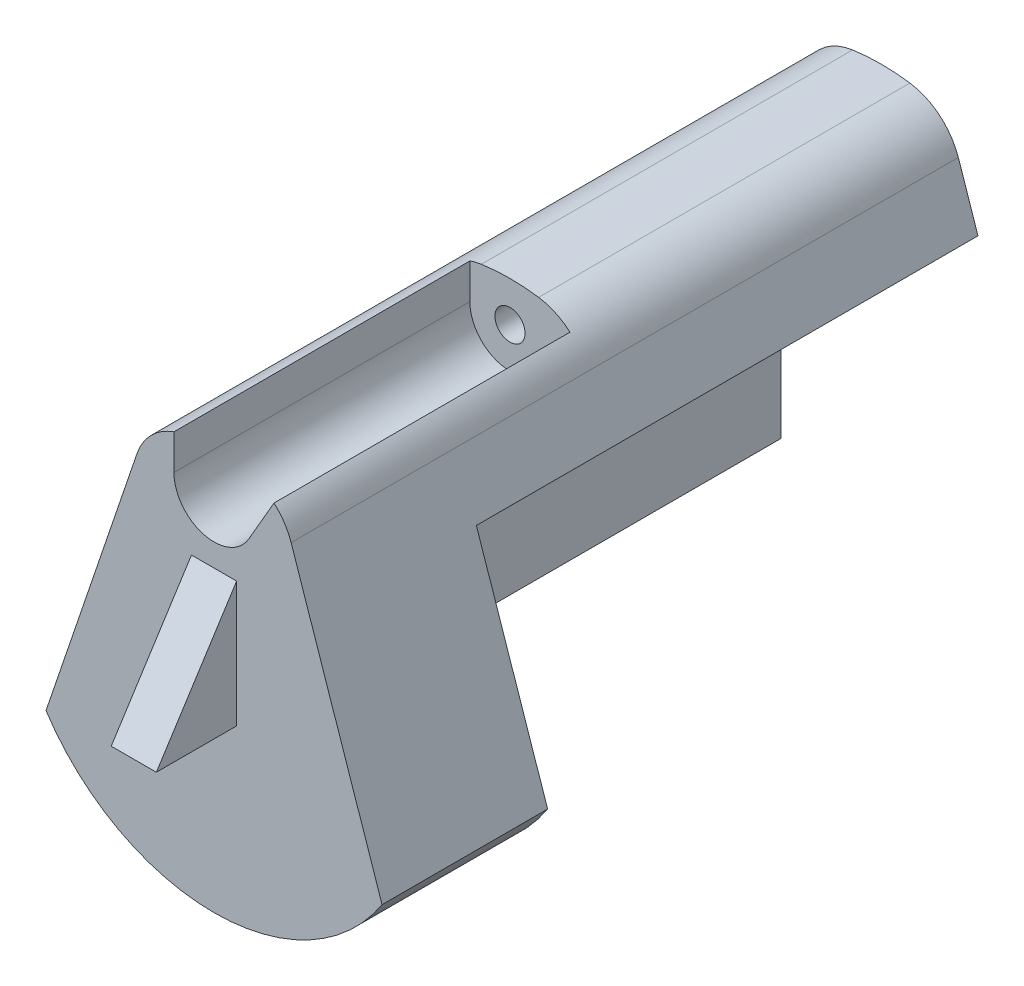
ISO-10303-21;
HEADER;
FILE_DESCRIPTION(('STEP AP214'),'2;1');
FILE_NAME('part.step','',(''),(''),'','','');
FILE_SCHEMA(('AUTOMOTIVE_DESIGN { 1 0 10303 214 1 1 1 1 }'));
ENDSEC;
DATA;
#1=APPLICATION_CONTEXT('core data for automotive mechanical design processes');
#2=APPLICATION_PROTOCOL_DEFINITION('international standard','automotive_design',2000,#1);
#3=PRODUCT_CONTEXT('',#1,'mechanical');
#4=PRODUCT('Part','Part','',(#3));
#5=PRODUCT_RELATED_PRODUCT_CATEGORY('part','',(#4));
#6=PRODUCT_DEFINITION_FORMATION('','',#4);
#7=PRODUCT_DEFINITION_CONTEXT('part definition',#1,'design');
#8=PRODUCT_DEFINITION('design','',#6,#7);
#9=PRODUCT_DEFINITION_SHAPE('','',#8);
#10=(LENGTH_UNIT() NAMED_UNIT(*) SI_UNIT(.MILLI.,.METRE.));
#11=(NAMED_UNIT(*) PLANE_ANGLE_UNIT() SI_UNIT($,.RADIAN.));
#12=(NAMED_UNIT(*) SI_UNIT($,.STERADIAN.) SOLID_ANGLE_UNIT());
#13=UNCERTAINTY_MEASURE_WITH_UNIT(LENGTH_MEASURE(1.E-05),#10,'distance_accuracy_value','');
#14=(GEOMETRIC_REPRESENTATION_CONTEXT(3) GLOBAL_UNCERTAINTY_ASSIGNED_CONTEXT((#13)) GLOBAL_UNIT_ASSIGNED_CONTEXT((#10,
#11,#12)) REPRESENTATION_CONTEXT('',''));
#15=CARTESIAN_POINT('',(0.,0.,0.));
#16=DIRECTION('',(0.,0.,1.));
#17=DIRECTION('',(1.,0.,0.));
#18=AXIS2_PLACEMENT_3D('',#15,#16,#17);
#19=CARTESIAN_POINT('',(0.,0.,66.5));
#20=DIRECTION('',(0.,0.,-1.));
#21=DIRECTION('',(-1.,0.,0.));
#22=AXIS2_PLACEMENT_3D('',#19,#20,#21);
#23=CYLINDRICAL_SURFACE('',#22,20.);
#24=DIRECTION('',(0.,0.,-1.));
#25=VECTOR('',#24,1.);
#26=CARTESIAN_POINT('',(-10.,-17.3205080756888,50.));
#27=LINE('',#26,#25);
#28=CARTESIAN_POINT('',(-10.,-17.3205080756888,50.));
#29=VERTEX_POINT('',#28);
#30=CARTESIAN_POINT('',(-10.,-17.3205080756888,0.));
#31=VERTEX_POINT('',#30);
#32=EDGE_CURVE('E72',#29,#31,#27,.T.);
#33=ORIENTED_EDGE('',*,*,#32,.F.);
#34=CARTESIAN_POINT('',(0.,0.,50.));
#35=DIRECTION('',(0.,0.,1.));
#36=DIRECTION('',(1.,0.,0.));
#37=AXIS2_PLACEMENT_3D('',#34,#35,#36);
#38=CIRCLE('',#37,20.);
#39=CARTESIAN_POINT('',(16.75,-10.9287464971972,50.));
#40=VERTEX_POINT('',#39);
#41=EDGE_CURVE('E212',#29,#40,#38,.T.);
#42=ORIENTED_EDGE('',*,*,#41,.T.);
#43=DIRECTION('',(0.,0.,-1.));
#44=VECTOR('',#43,1.);
#45=CARTESIAN_POINT('',(16.75,-10.9287464971972,66.5));
#46=LINE('',#45,#44);
#47=CARTESIAN_POINT('',(16.75,-10.9287464971972,66.5));
#48=VERTEX_POINT('',#47);
#49=EDGE_CURVE('E339',#48,#40,#46,.T.);
#50=ORIENTED_EDGE('',*,*,#49,.F.);
#51=CARTESIAN_POINT('',(0.,0.,66.5));
#52=DIRECTION('',(0.,0.,1.));
#53=DIRECTION('',(1.,0.,0.));
#54=AXIS2_PLACEMENT_3D('',#51,#52,#53);
#55=CIRCLE('',#54,20.);
#56=CARTESIAN_POINT('',(-16.75,-10.9287464971972,66.5));
#57=VERTEX_POINT('',#56);
#58=EDGE_CURVE('E277',#57,#48,#55,.T.);
#59=ORIENTED_EDGE('',*,*,#58,.F.);
#60=DIRECTION('',(0.,0.,-1.));
#61=VECTOR('',#60,1.);
#62=CARTESIAN_POINT('',(-16.75,-10.9287464971972,66.5));
#63=LINE('',#62,#61);
#64=CARTESIAN_POINT('',(-16.75,-10.9287464971972,0.));
#65=VERTEX_POINT('',#64);
#66=EDGE_CURVE('E297',#57,#65,#63,.T.);
#67=ORIENTED_EDGE('',*,*,#66,.T.);
#68=CARTESIAN_POINT('',(0.,0.,0.));
#69=DIRECTION('',(0.,0.,1.));
#70=DIRECTION('',(1.,0.,0.));
#71=AXIS2_PLACEMENT_3D('',#68,#69,#70);
#72=CIRCLE('',#71,20.);
#73=EDGE_CURVE('E298',#65,#31,#72,.T.);
#74=ORIENTED_EDGE('',*,*,#73,.T.);
#75=EDGE_LOOP('',(#33,#42,#50,#59,#67,#74));
#76=FACE_BOUND('',#75,.T.);
#77=ADVANCED_FACE('F47',(#76),#23,.T.);
#78=CARTESIAN_POINT('',(0.,0.,66.5));
#79=DIRECTION('',(0.,0.,-1.));
#80=DIRECTION('',(-1.,0.,0.));
#81=AXIS2_PLACEMENT_3D('',#78,#79,#80);
#82=CYLINDRICAL_SURFACE('',#81,20.);
#83=CARTESIAN_POINT('',(0.,0.,37.));
#84=DIRECTION('',(0.,0.,1.));
#85=DIRECTION('',(1.,0.,0.));
#86=AXIS2_PLACEMENT_3D('',#83,#84,#85);
#87=CIRCLE('',#86,20.);
#88=CARTESIAN_POINT('',(2.85760781460312,19.7947992558126,37.));
#89=VERTEX_POINT('',#88);
#90=CARTESIAN_POINT('',(-2.85760781460312,19.7947992558126,37.));
#91=VERTEX_POINT('',#90);
#92=EDGE_CURVE('E252',#89,#91,#87,.T.);
#93=ORIENTED_EDGE('',*,*,#92,.F.);
#94=DIRECTION('',(0.,0.,-1.));
#95=VECTOR('',#94,1.);
#96=CARTESIAN_POINT('',(2.85760781460312,19.7947992558126,66.5));
#97=LINE('',#96,#95);
#98=CARTESIAN_POINT('',(2.85760781460312,19.7947992558126,0.));
#99=VERTEX_POINT('',#98);
#100=EDGE_CURVE('E332',#89,#99,#97,.T.);
#101=ORIENTED_EDGE('',*,*,#100,.T.);
#102=CARTESIAN_POINT('',(0.,0.,0.));
#103=DIRECTION('',(0.,0.,1.));
#104=DIRECTION('',(1.,0.,0.));
#105=AXIS2_PLACEMENT_3D('',#102,#103,#104);
#106=CIRCLE('',#105,20.);
#107=CARTESIAN_POINT('',(-2.85760781460312,19.7947992558126,0.));
#108=VERTEX_POINT('',#107);
#109=EDGE_CURVE('E309',#99,#108,#106,.T.);
#110=ORIENTED_EDGE('',*,*,#109,.T.);
#111=DIRECTION('',(0.,0.,-1.));
#112=VECTOR('',#111,1.);
#113=CARTESIAN_POINT('',(-2.85760781460312,19.7947992558126,66.5));
#114=LINE('',#113,#112);
#115=EDGE_CURVE('E329',#91,#108,#114,.T.);
#116=ORIENTED_EDGE('',*,*,#115,.F.);
#117=EDGE_LOOP('',(#93,#101,#110,#116));
#118=FACE_BOUND('',#117,.T.);
#119=ADVANCED_FACE('F372',(#118),#82,.T.);
#120=CARTESIAN_POINT('',(0.,16.,66.5));
#121=DIRECTION('',(0.,0.,-1.));
#122=DIRECTION('',(-1.,0.,0.));
#123=AXIS2_PLACEMENT_3D('',#120,#121,#122);
#124=CYLINDRICAL_SURFACE('',#123,1.5);
#125=CARTESIAN_POINT('',(0.,16.,0.));
#126=DIRECTION('',(0.,0.,1.));
#127=DIRECTION('',(1.,0.,0.));
#128=AXIS2_PLACEMENT_3D('',#125,#126,#127);
#129=CIRCLE('',#128,1.5);
#130=CARTESIAN_POINT('',(1.5,16.,0.));
#131=VERTEX_POINT('',#130);
#132=EDGE_CURVE('E282',#131,#131,#129,.T.);
#133=ORIENTED_EDGE('',*,*,#132,.F.);
#134=EDGE_LOOP('',(#133));
#135=FACE_BOUND('',#134,.T.);
#136=CARTESIAN_POINT('',(0.,16.,37.));
#137=DIRECTION('',(0.,0.,1.));
#138=DIRECTION('',(1.,0.,0.));
#139=AXIS2_PLACEMENT_3D('',#136,#137,#138);
#140=CIRCLE('',#139,1.5);
#141=CARTESIAN_POINT('',(1.5,16.,37.));
#142=VERTEX_POINT('',#141);
#143=EDGE_CURVE('E274',#142,#142,#140,.T.);
#144=ORIENTED_EDGE('',*,*,#143,.T.);
#145=EDGE_LOOP('',(#144));
#146=FACE_BOUND('',#145,.T.);
#147=ADVANCED_FACE('F426',(#135,#146),#124,.F.);
#148=CARTESIAN_POINT('',(11.6928345574852,3.96918248872321,66.5));
#149=DIRECTION('',(-0.946930129495105,-0.321439465303162,0.));
#150=DIRECTION('',(0.321439465303162,-0.946930129495105,0.));
#151=AXIS2_PLACEMENT_3D('',#148,#149,#150);
#152=PLANE('',#151);
#153=DIRECTION('',(-0.321439465303162,0.946930129495105,0.));
#154=VECTOR('',#153,1.);
#155=CARTESIAN_POINT('',(11.6928345574852,3.96918248872321,50.));
#156=LINE('',#155,#154);
#157=CARTESIAN_POINT('',(9.64564786885443,10.,50.));
#158=VERTEX_POINT('',#157);
#159=EDGE_CURVE('E216',#40,#158,#156,.T.);
#160=ORIENTED_EDGE('',*,*,#159,.T.);
#161=DIRECTION('',(0.,0.,-1.));
#162=VECTOR('',#161,1.);
#163=CARTESIAN_POINT('',(9.64564786885443,10.,50.));
#164=LINE('',#163,#162);
#165=CARTESIAN_POINT('',(9.64564786885443,10.,0.));
#166=VERTEX_POINT('',#165);
#167=EDGE_CURVE('E220',#158,#166,#164,.T.);
#168=ORIENTED_EDGE('',*,*,#167,.T.);
#169=DIRECTION('',(-0.321439465303162,0.946930129495105,0.));
#170=VECTOR('',#169,1.);
#171=CARTESIAN_POINT('',(11.6928345574852,3.96918248872321,0.));
#172=LINE('',#171,#170);
#173=CARTESIAN_POINT('',(7.68190624719282,15.7849962708878,0.));
#174=VERTEX_POINT('',#173);
#175=EDGE_CURVE('E302',#166,#174,#172,.T.);
#176=ORIENTED_EDGE('',*,*,#175,.T.);
#177=DIRECTION('',(0.,0.,-1.));
#178=VECTOR('',#177,1.);
#179=CARTESIAN_POINT('',(7.68190624719282,15.7849962708878,66.5));
#180=LINE('',#179,#178);
#181=CARTESIAN_POINT('',(7.68190624719282,15.7849962708878,66.5));
#182=VERTEX_POINT('',#181);
#183=EDGE_CURVE('E335',#182,#174,#180,.T.);
#184=ORIENTED_EDGE('',*,*,#183,.F.);
#185=DIRECTION('',(-0.321439465303162,0.946930129495105,0.));
#186=VECTOR('',#185,1.);
#187=CARTESIAN_POINT('',(11.6928345574852,3.96918248872321,66.5));
#188=LINE('',#187,#186);
#189=EDGE_CURVE('E281',#48,#182,#188,.T.);
#190=ORIENTED_EDGE('',*,*,#189,.F.);
#191=ORIENTED_EDGE('',*,*,#49,.T.);
#192=EDGE_LOOP('',(#160,#168,#176,#184,#190,#191));
#193=FACE_BOUND('',#192,.T.);
#194=ADVANCED_FACE('F392',(#193),#152,.F.);
#195=CARTESIAN_POINT('',(2.00032547022219,13.8563594790688,66.5));
#196=DIRECTION('',(0.,0.,-1.));
#197=DIRECTION('',(-1.,0.,0.));
#198=AXIS2_PLACEMENT_3D('',#195,#196,#197);
#199=CYLINDRICAL_SURFACE('',#198,6.);
#200=CARTESIAN_POINT('',(2.00032547022219,13.8563594790688,37.));
#201=DIRECTION('',(0.,0.,1.));
#202=DIRECTION('',(1.,0.,0.));
#203=AXIS2_PLACEMENT_3D('',#200,#201,#202);
#204=CIRCLE('',#203,6.);
#205=CARTESIAN_POINT('',(5.97577019329374,18.3503375891404,37.));
#206=VERTEX_POINT('',#205);
#207=EDGE_CURVE('E249',#206,#89,#204,.T.);
#208=ORIENTED_EDGE('',*,*,#207,.F.);
#209=DIRECTION('',(0.,0.,1.));
#210=VECTOR('',#209,1.);
#211=CARTESIAN_POINT('',(5.97577019329374,18.3503375891404,37.));
#212=LINE('',#211,#210);
#213=CARTESIAN_POINT('',(5.97577019329374,18.3503375891404,66.5));
#214=VERTEX_POINT('',#213);
#215=EDGE_CURVE('E265',#206,#214,#212,.T.);
#216=ORIENTED_EDGE('',*,*,#215,.T.);
#217=CARTESIAN_POINT('',(2.00032547022219,13.8563594790688,66.5));
#218=DIRECTION('',(0.,0.,1.));
#219=DIRECTION('',(1.,0.,0.));
#220=AXIS2_PLACEMENT_3D('',#217,#218,#219);
#221=CIRCLE('',#220,6.);
#222=EDGE_CURVE('E285',#182,#214,#221,.T.);
#223=ORIENTED_EDGE('',*,*,#222,.F.);
#224=ORIENTED_EDGE('',*,*,#183,.T.);
#225=CARTESIAN_POINT('',(2.00032547022219,13.8563594790688,0.));
#226=DIRECTION('',(0.,0.,1.));
#227=DIRECTION('',(1.,0.,0.));
#228=AXIS2_PLACEMENT_3D('',#225,#226,#227);
#229=CIRCLE('',#228,6.);
#230=EDGE_CURVE('E305',#174,#99,#229,.T.);
#231=ORIENTED_EDGE('',*,*,#230,.T.);
#232=ORIENTED_EDGE('',*,*,#100,.F.);
#233=EDGE_LOOP('',(#208,#216,#223,#224,#231,#232));
#234=FACE_BOUND('',#233,.T.);
#235=ADVANCED_FACE('F364',(#234),#199,.T.);
#236=CARTESIAN_POINT('',(-2.00032547022219,13.8563594790688,66.5));
#237=DIRECTION('',(0.,0.,-1.));
#238=DIRECTION('',(-1.,0.,0.));
#239=AXIS2_PLACEMENT_3D('',#236,#237,#238);
#240=CYLINDRICAL_SURFACE('',#239,6.);
#241=DIRECTION('',(0.,0.,1.));
#242=VECTOR('',#241,1.);
#243=CARTESIAN_POINT('',(-4.,19.5133287891286,37.));
#244=LINE('',#243,#242);
#245=CARTESIAN_POINT('',(-4.,19.5133287891286,37.));
#246=VERTEX_POINT('',#245);
#247=CARTESIAN_POINT('',(-4.,19.5133287891286,66.5));
#248=VERTEX_POINT('',#247);
#249=EDGE_CURVE('E269',#246,#248,#244,.T.);
#250=ORIENTED_EDGE('',*,*,#249,.F.);
#251=CARTESIAN_POINT('',(-2.00032547022219,13.8563594790688,37.));
#252=DIRECTION('',(0.,0.,1.));
#253=DIRECTION('',(1.,0.,0.));
#254=AXIS2_PLACEMENT_3D('',#251,#252,#253);
#255=CIRCLE('',#254,6.);
#256=EDGE_CURVE('E255',#91,#246,#255,.T.);
#257=ORIENTED_EDGE('',*,*,#256,.F.);
#258=ORIENTED_EDGE('',*,*,#115,.T.);
#259=CARTESIAN_POINT('',(-2.00032547022219,13.8563594790688,0.));
#260=DIRECTION('',(0.,0.,1.));
#261=DIRECTION('',(1.,0.,0.));
#262=AXIS2_PLACEMENT_3D('',#259,#260,#261);
#263=CIRCLE('',#262,6.);
#264=CARTESIAN_POINT('',(-7.68190624719282,15.7849962708878,0.));
#265=VERTEX_POINT('',#264);
#266=EDGE_CURVE('E313',#265,#108,#263,.F.);
#267=ORIENTED_EDGE('',*,*,#266,.F.);
#268=DIRECTION('',(0.,0.,-1.));
#269=VECTOR('',#268,1.);
#270=CARTESIAN_POINT('',(-7.68190624719282,15.7849962708878,66.5));
#271=LINE('',#270,#269);
#272=CARTESIAN_POINT('',(-7.68190624719282,15.7849962708878,66.5));
#273=VERTEX_POINT('',#272);
#274=EDGE_CURVE('E326',#273,#265,#271,.T.);
#275=ORIENTED_EDGE('',*,*,#274,.F.);
#276=CARTESIAN_POINT('',(-2.00032547022219,13.8563594790688,66.5));
#277=DIRECTION('',(0.,0.,1.));
#278=DIRECTION('',(1.,0.,0.));
#279=AXIS2_PLACEMENT_3D('',#276,#277,#278);
#280=CIRCLE('',#279,6.);
#281=EDGE_CURVE('E289',#273,#248,#280,.F.);
#282=ORIENTED_EDGE('',*,*,#281,.T.);
#283=EDGE_LOOP('',(#250,#257,#258,#267,#275,#282));
#284=FACE_BOUND('',#283,.T.);
#285=ADVANCED_FACE('F377',(#284),#240,.T.);
#286=CARTESIAN_POINT('',(-11.6928345574852,3.96918248872321,66.5));
#287=DIRECTION('',(-0.946930129495105,0.321439465303162,0.));
#288=DIRECTION('',(-0.321439465303162,-0.946930129495105,0.));
#289=AXIS2_PLACEMENT_3D('',#286,#287,#288);
#290=PLANE('',#289);
#291=DIRECTION('',(0.321439465303162,0.946930129495105,0.));
#292=VECTOR('',#291,1.);
#293=CARTESIAN_POINT('',(-11.6928345574852,3.96918248872321,0.));
#294=LINE('',#293,#292);
#295=EDGE_CURVE('E317',#65,#265,#294,.T.);
#296=ORIENTED_EDGE('',*,*,#295,.F.);
#297=ORIENTED_EDGE('',*,*,#66,.F.);
#298=DIRECTION('',(0.321439465303162,0.946930129495105,0.));
#299=VECTOR('',#298,1.);
#300=CARTESIAN_POINT('',(-11.6928345574852,3.96918248872321,66.5));
#301=LINE('',#300,#299);
#302=EDGE_CURVE('E293',#57,#273,#301,.T.);
#303=ORIENTED_EDGE('',*,*,#302,.T.);
#304=ORIENTED_EDGE('',*,*,#274,.T.);
#305=EDGE_LOOP('',(#296,#297,#303,#304));
#306=FACE_BOUND('',#305,.T.);
#307=ADVANCED_FACE('F385',(#306),#290,.T.);
#308=CARTESIAN_POINT('',(0.,0.,66.5));
#309=DIRECTION('',(0.,0.,1.));
#310=DIRECTION('',(1.,0.,0.));
#311=AXIS2_PLACEMENT_3D('',#308,#309,#310);
#312=PLANE('',#311);
#313=DIRECTION('',(0.,1.,0.));
#314=VECTOR('',#313,1.);
#315=CARTESIAN_POINT('',(2.25,9.75,66.5));
#316=LINE('',#315,#314);
#317=CARTESIAN_POINT('',(2.25,-2.75,66.5));
#318=VERTEX_POINT('',#317);
#319=CARTESIAN_POINT('',(2.25,9.75,66.5));
#320=VERTEX_POINT('',#319);
#321=EDGE_CURVE('E179',#318,#320,#316,.T.);
#322=ORIENTED_EDGE('',*,*,#321,.F.);
#323=DIRECTION('',(-1.,0.,0.));
#324=VECTOR('',#323,1.);
#325=CARTESIAN_POINT('',(2.25,-2.75,66.5));
#326=LINE('',#325,#324);
#327=CARTESIAN_POINT('',(-2.25,-2.75,66.5));
#328=VERTEX_POINT('',#327);
#329=EDGE_CURVE('E175',#318,#328,#326,.T.);
#330=ORIENTED_EDGE('',*,*,#329,.T.);
#331=DIRECTION('',(0.,1.,0.));
#332=VECTOR('',#331,1.);
#333=CARTESIAN_POINT('',(-2.25,9.75,66.5));
#334=LINE('',#333,#332);
#335=CARTESIAN_POINT('',(-2.25,9.75,66.5));
#336=VERTEX_POINT('',#335);
#337=EDGE_CURVE('E187',#328,#336,#334,.T.);
#338=ORIENTED_EDGE('',*,*,#337,.T.);
#339=DIRECTION('',(-1.,0.,0.));
#340=VECTOR('',#339,1.);
#341=CARTESIAN_POINT('',(2.25,9.75,66.5));
#342=LINE('',#341,#340);
#343=EDGE_CURVE('E197',#320,#336,#342,.T.);
#344=ORIENTED_EDGE('',*,*,#343,.F.);
#345=EDGE_LOOP('',(#322,#330,#338,#344));
#346=FACE_BOUND('',#345,.T.);
#347=DIRECTION('',(0.,1.,0.));
#348=VECTOR('',#347,1.);
#349=CARTESIAN_POINT('',(-4.,16.,66.5));
#350=LINE('',#349,#348);
#351=CARTESIAN_POINT('',(-4.,16.,66.5));
#352=VERTEX_POINT('',#351);
#353=EDGE_CURVE('E11',#248,#352,#350,.F.);
#354=ORIENTED_EDGE('',*,*,#353,.F.);
#355=ORIENTED_EDGE('',*,*,#281,.F.);
#356=ORIENTED_EDGE('',*,*,#302,.F.);
#357=ORIENTED_EDGE('',*,*,#58,.T.);
#358=ORIENTED_EDGE('',*,*,#189,.T.);
#359=ORIENTED_EDGE('',*,*,#222,.T.);
#360=DIRECTION('',(0.500000000000004,0.866025403784436,0.));
#361=VECTOR('',#360,1.);
#362=CARTESIAN_POINT('',(3.46410161513775,14.,66.5));
#363=LINE('',#362,#361);
#364=CARTESIAN_POINT('',(3.46410161513775,14.,66.5));
#365=VERTEX_POINT('',#364);
#366=EDGE_CURVE('E343',#365,#214,#363,.T.);
#367=ORIENTED_EDGE('',*,*,#366,.F.);
#368=CARTESIAN_POINT('',(0.,16.,66.5));
#369=DIRECTION('',(0.,0.,1.));
#370=DIRECTION('',(1.,0.,0.));
#371=AXIS2_PLACEMENT_3D('',#368,#369,#370);
#372=CIRCLE('',#371,4.);
#373=EDGE_CURVE('E56',#352,#365,#372,.T.);
#374=ORIENTED_EDGE('',*,*,#373,.F.);
#375=EDGE_LOOP('',(#354,#355,#356,#357,#358,#359,#367,#374));
#376=FACE_BOUND('',#375,.T.);
#377=ADVANCED_FACE('F358',(#346,#376),#312,.T.);
#378=CARTESIAN_POINT('',(0.,0.,0.));
#379=DIRECTION('',(0.,0.,1.));
#380=DIRECTION('',(1.,0.,0.));
#381=AXIS2_PLACEMENT_3D('',#378,#379,#380);
#382=PLANE('',#381);
#383=ORIENTED_EDGE('',*,*,#175,.F.);
#384=DIRECTION('',(1.,0.,0.));
#385=VECTOR('',#384,1.);
#386=CARTESIAN_POINT('',(0.,10.,0.));
#387=LINE('',#386,#385);
#388=CARTESIAN_POINT('',(0.,10.,0.));
#389=VERTEX_POINT('',#388);
#390=EDGE_CURVE('E221',#389,#166,#387,.T.);
#391=ORIENTED_EDGE('',*,*,#390,.F.);
#392=CARTESIAN_POINT('',(0.,0.,0.));
#393=DIRECTION('',(0.,0.,1.));
#394=DIRECTION('',(1.,0.,0.));
#395=AXIS2_PLACEMENT_3D('',#392,#393,#394);
#396=CIRCLE('',#395,10.);
#397=CARTESIAN_POINT('',(-10.,0.,0.));
#398=VERTEX_POINT('',#397);
#399=EDGE_CURVE('E224',#389,#398,#396,.T.);
#400=ORIENTED_EDGE('',*,*,#399,.T.);
#401=DIRECTION('',(0.,-1.,0.));
#402=VECTOR('',#401,1.);
#403=CARTESIAN_POINT('',(-10.,0.,0.));
#404=LINE('',#403,#402);
#405=EDGE_CURVE('E206',#398,#31,#404,.T.);
#406=ORIENTED_EDGE('',*,*,#405,.T.);
#407=ORIENTED_EDGE('',*,*,#73,.F.);
#408=ORIENTED_EDGE('',*,*,#295,.T.);
#409=ORIENTED_EDGE('',*,*,#266,.T.);
#410=ORIENTED_EDGE('',*,*,#109,.F.);
#411=ORIENTED_EDGE('',*,*,#230,.F.);
#412=EDGE_LOOP('',(#383,#391,#400,#406,#407,#408,#409,#410,#411));
#413=FACE_BOUND('',#412,.T.);
#414=ORIENTED_EDGE('',*,*,#132,.T.);
#415=EDGE_LOOP('',(#414));
#416=FACE_BOUND('',#415,.T.);
#417=ADVANCED_FACE('F396',(#413,#416),#382,.F.);
#418=CARTESIAN_POINT('',(0.,16.,37.));
#419=DIRECTION('',(0.,0.,1.));
#420=DIRECTION('',(1.,0.,0.));
#421=AXIS2_PLACEMENT_3D('',#418,#419,#420);
#422=CYLINDRICAL_SURFACE('',#421,4.);
#423=ORIENTED_EDGE('',*,*,#373,.T.);
#424=DIRECTION('',(0.,0.,1.));
#425=VECTOR('',#424,1.);
#426=CARTESIAN_POINT('',(3.46410161513775,14.,37.));
#427=LINE('',#426,#425);
#428=CARTESIAN_POINT('',(3.46410161513775,14.,37.));
#429=VERTEX_POINT('',#428);
#430=EDGE_CURVE('E262',#429,#365,#427,.T.);
#431=ORIENTED_EDGE('',*,*,#430,.F.);
#432=CARTESIAN_POINT('',(0.,16.,37.));
#433=DIRECTION('',(0.,0.,1.));
#434=DIRECTION('',(1.,0.,0.));
#435=AXIS2_PLACEMENT_3D('',#432,#433,#434);
#436=CIRCLE('',#435,4.);
#437=CARTESIAN_POINT('',(-4.,16.,37.));
#438=VERTEX_POINT('',#437);
#439=EDGE_CURVE('E241',#438,#429,#436,.T.);
#440=ORIENTED_EDGE('',*,*,#439,.F.);
#441=DIRECTION('',(0.,0.,1.));
#442=VECTOR('',#441,1.);
#443=CARTESIAN_POINT('',(-4.,16.,37.));
#444=LINE('',#443,#442);
#445=EDGE_CURVE('E270',#438,#352,#444,.T.);
#446=ORIENTED_EDGE('',*,*,#445,.T.);
#447=EDGE_LOOP('',(#423,#431,#440,#446));
#448=FACE_BOUND('',#447,.T.);
#449=ADVANCED_FACE('F353',(#448),#422,.F.);
#450=CARTESIAN_POINT('',(-4.,16.,37.));
#451=DIRECTION('',(-1.,0.,0.));
#452=DIRECTION('',(0.,0.,1.));
#453=AXIS2_PLACEMENT_3D('',#450,#451,#452);
#454=PLANE('',#453);
#455=ORIENTED_EDGE('',*,*,#353,.T.);
#456=ORIENTED_EDGE('',*,*,#445,.F.);
#457=DIRECTION('',(0.,-1.,0.));
#458=VECTOR('',#457,1.);
#459=CARTESIAN_POINT('',(-4.,16.,37.));
#460=LINE('',#459,#458);
#461=EDGE_CURVE('E258',#246,#438,#460,.T.);
#462=ORIENTED_EDGE('',*,*,#461,.F.);
#463=ORIENTED_EDGE('',*,*,#249,.T.);
#464=EDGE_LOOP('',(#455,#456,#462,#463));
#465=FACE_BOUND('',#464,.T.);
#466=ADVANCED_FACE('F380',(#465),#454,.F.);
#467=CARTESIAN_POINT('',(3.46410161513775,14.,37.));
#468=DIRECTION('',(0.866025403784436,-0.500000000000004,0.));
#469=DIRECTION('',(0.500000000000004,0.866025403784436,0.));
#470=AXIS2_PLACEMENT_3D('',#467,#468,#469);
#471=PLANE('',#470);
#472=ORIENTED_EDGE('',*,*,#366,.T.);
#473=ORIENTED_EDGE('',*,*,#215,.F.);
#474=DIRECTION('',(0.500000000000004,0.866025403784436,0.));
#475=VECTOR('',#474,1.);
#476=CARTESIAN_POINT('',(3.46410161513775,14.,37.));
#477=LINE('',#476,#475);
#478=EDGE_CURVE('E245',#429,#206,#477,.T.);
#479=ORIENTED_EDGE('',*,*,#478,.F.);
#480=ORIENTED_EDGE('',*,*,#430,.T.);
#481=EDGE_LOOP('',(#472,#473,#479,#480));
#482=FACE_BOUND('',#481,.T.);
#483=ADVANCED_FACE('F361',(#482),#471,.F.);
#484=CARTESIAN_POINT('',(0.,16.,37.));
#485=DIRECTION('',(0.,0.,1.));
#486=DIRECTION('',(1.,0.,0.));
#487=AXIS2_PLACEMENT_3D('',#484,#485,#486);
#488=PLANE('',#487);
#489=ORIENTED_EDGE('',*,*,#143,.F.);
#490=EDGE_LOOP('',(#489));
#491=FACE_BOUND('',#490,.T.);
#492=ORIENTED_EDGE('',*,*,#439,.T.);
#493=ORIENTED_EDGE('',*,*,#478,.T.);
#494=ORIENTED_EDGE('',*,*,#207,.T.);
#495=ORIENTED_EDGE('',*,*,#92,.T.);
#496=ORIENTED_EDGE('',*,*,#256,.T.);
#497=ORIENTED_EDGE('',*,*,#461,.T.);
#498=EDGE_LOOP('',(#492,#493,#494,#495,#496,#497));
#499=FACE_BOUND('',#498,.T.);
#500=ADVANCED_FACE('F368',(#491,#499),#488,.T.);
#501=CARTESIAN_POINT('',(0.,10.,50.));
#502=DIRECTION('',(0.,1.,0.));
#503=DIRECTION('',(-1.,0.,0.));
#504=AXIS2_PLACEMENT_3D('',#501,#502,#503);
#505=PLANE('',#504);
#506=ORIENTED_EDGE('',*,*,#390,.T.);
#507=ORIENTED_EDGE('',*,*,#167,.F.);
#508=DIRECTION('',(1.,0.,0.));
#509=VECTOR('',#508,1.);
#510=CARTESIAN_POINT('',(0.,10.,50.));
#511=LINE('',#510,#509);
#512=CARTESIAN_POINT('',(0.,10.,50.));
#513=VERTEX_POINT('',#512);
#514=EDGE_CURVE('E201',#513,#158,#511,.T.);
#515=ORIENTED_EDGE('',*,*,#514,.F.);
#516=DIRECTION('',(0.,0.,-1.));
#517=VECTOR('',#516,1.);
#518=CARTESIAN_POINT('',(0.,10.,50.));
#519=LINE('',#518,#517);
#520=EDGE_CURVE('E238',#513,#389,#519,.T.);
#521=ORIENTED_EDGE('',*,*,#520,.T.);
#522=EDGE_LOOP('',(#506,#507,#515,#521));
#523=FACE_BOUND('',#522,.T.);
#524=ADVANCED_FACE('F410',(#523),#505,.F.);
#525=CARTESIAN_POINT('',(0.,0.,50.));
#526=DIRECTION('',(0.,0.,-1.));
#527=DIRECTION('',(-1.,0.,0.));
#528=AXIS2_PLACEMENT_3D('',#525,#526,#527);
#529=CYLINDRICAL_SURFACE('',#528,10.);
#530=ORIENTED_EDGE('',*,*,#399,.F.);
#531=ORIENTED_EDGE('',*,*,#520,.F.);
#532=CARTESIAN_POINT('',(0.,0.,50.));
#533=DIRECTION('',(0.,0.,1.));
#534=DIRECTION('',(1.,0.,0.));
#535=AXIS2_PLACEMENT_3D('',#532,#533,#534);
#536=CIRCLE('',#535,10.);
#537=CARTESIAN_POINT('',(-10.,0.,50.));
#538=VERTEX_POINT('',#537);
#539=EDGE_CURVE('E205',#513,#538,#536,.T.);
#540=ORIENTED_EDGE('',*,*,#539,.T.);
#541=DIRECTION('',(0.,0.,-1.));
#542=VECTOR('',#541,1.);
#543=CARTESIAN_POINT('',(-10.,0.,50.));
#544=LINE('',#543,#542);
#545=EDGE_CURVE('E235',#538,#398,#544,.T.);
#546=ORIENTED_EDGE('',*,*,#545,.T.);
#547=EDGE_LOOP('',(#530,#531,#540,#546));
#548=FACE_BOUND('',#547,.T.);
#549=ADVANCED_FACE('F411',(#548),#529,.F.);
#550=CARTESIAN_POINT('',(-10.,0.,50.));
#551=DIRECTION('',(1.,0.,0.));
#552=DIRECTION('',(0.,0.,-1.));
#553=AXIS2_PLACEMENT_3D('',#550,#551,#552);
#554=PLANE('',#553);
#555=ORIENTED_EDGE('',*,*,#405,.F.);
#556=ORIENTED_EDGE('',*,*,#545,.F.);
#557=DIRECTION('',(0.,-1.,0.));
#558=VECTOR('',#557,1.);
#559=CARTESIAN_POINT('',(-10.,0.,50.));
#560=LINE('',#559,#558);
#561=EDGE_CURVE('E209',#538,#29,#560,.T.);
#562=ORIENTED_EDGE('',*,*,#561,.T.);
#563=ORIENTED_EDGE('',*,*,#32,.T.);
#564=EDGE_LOOP('',(#555,#556,#562,#563));
#565=FACE_BOUND('',#564,.T.);
#566=ADVANCED_FACE('F402',(#565),#554,.T.);
#567=CARTESIAN_POINT('',(0.,0.,50.));
#568=DIRECTION('',(0.,0.,1.));
#569=DIRECTION('',(1.,0.,0.));
#570=AXIS2_PLACEMENT_3D('',#567,#568,#569);
#571=PLANE('',#570);
#572=CARTESIAN_POINT('',(0.,0.,50.));
#573=DIRECTION('',(0.,0.,1.));
#574=DIRECTION('',(1.,0.,0.));
#575=AXIS2_PLACEMENT_3D('',#572,#573,#574);
#576=CIRCLE('',#575,8.25);
#577=CARTESIAN_POINT('',(8.25,0.,50.));
#578=VERTEX_POINT('',#577);
#579=EDGE_CURVE('E50',#578,#578,#576,.F.);
#580=ORIENTED_EDGE('',*,*,#579,.F.);
#581=EDGE_LOOP('',(#580));
#582=FACE_BOUND('',#581,.T.);
#583=ORIENTED_EDGE('',*,*,#514,.T.);
#584=ORIENTED_EDGE('',*,*,#159,.F.);
#585=ORIENTED_EDGE('',*,*,#41,.F.);
#586=ORIENTED_EDGE('',*,*,#561,.F.);
#587=ORIENTED_EDGE('',*,*,#539,.F.);
#588=EDGE_LOOP('',(#583,#584,#585,#586,#587));
#589=FACE_BOUND('',#588,.T.);
#590=ADVANCED_FACE('F407',(#582,#589),#571,.F.);
#591=CARTESIAN_POINT('',(0.,0.,60.));
#592=DIRECTION('',(0.,0.,-1.));
#593=DIRECTION('',(-1.,0.,0.));
#594=AXIS2_PLACEMENT_3D('',#591,#592,#593);
#595=CYLINDRICAL_SURFACE('',#594,8.25);
#596=CARTESIAN_POINT('',(0.,0.,60.));
#597=DIRECTION('',(0.,0.,1.));
#598=DIRECTION('',(1.,0.,0.));
#599=AXIS2_PLACEMENT_3D('',#596,#597,#598);
#600=CIRCLE('',#599,8.25);
#601=CARTESIAN_POINT('',(8.25,0.,60.));
#602=VERTEX_POINT('',#601);
#603=EDGE_CURVE('E191',#602,#602,#600,.T.);
#604=ORIENTED_EDGE('',*,*,#603,.T.);
#605=EDGE_LOOP('',(#604));
#606=FACE_BOUND('',#605,.T.);
#607=ORIENTED_EDGE('',*,*,#579,.T.);
#608=EDGE_LOOP('',(#607));
#609=FACE_BOUND('',#608,.T.);
#610=ADVANCED_FACE('F478',(#606,#609),#595,.F.);
#611=CARTESIAN_POINT('',(0.,0.,60.));
#612=DIRECTION('',(0.,0.,1.));
#613=DIRECTION('',(1.,0.,0.));
#614=AXIS2_PLACEMENT_3D('',#611,#612,#613);
#615=PLANE('',#614);
#616=ORIENTED_EDGE('',*,*,#603,.F.);
#617=EDGE_LOOP('',(#616));
#618=FACE_BOUND('',#617,.T.);
#619=ADVANCED_FACE('F488',(#618),#615,.F.);
#620=CARTESIAN_POINT('',(2.25,-2.75,74.5));
#621=DIRECTION('',(0.,-0.539053696423368,-0.842271400661511));
#622=DIRECTION('',(0.,0.842271400661511,-0.539053696423368));
#623=AXIS2_PLACEMENT_3D('',#620,#621,#622);
#624=PLANE('',#623);
#625=DIRECTION('',(0.,-0.842271400661511,0.539053696423368));
#626=VECTOR('',#625,1.);
#627=CARTESIAN_POINT('',(-2.25,-2.75,74.5));
#628=LINE('',#627,#626);
#629=CARTESIAN_POINT('',(-2.25,-2.75,74.5));
#630=VERTEX_POINT('',#629);
#631=EDGE_CURVE('E64',#336,#630,#628,.T.);
#632=ORIENTED_EDGE('',*,*,#631,.T.);
#633=DIRECTION('',(-1.,0.,0.));
#634=VECTOR('',#633,1.);
#635=CARTESIAN_POINT('',(2.25,-2.75,74.5));
#636=LINE('',#635,#634);
#637=CARTESIAN_POINT('',(2.25,-2.75,74.5));
#638=VERTEX_POINT('',#637);
#639=EDGE_CURVE('E173',#638,#630,#636,.T.);
#640=ORIENTED_EDGE('',*,*,#639,.F.);
#641=DIRECTION('',(0.,-0.842271400661511,0.539053696423368));
#642=VECTOR('',#641,1.);
#643=CARTESIAN_POINT('',(2.25,-2.75,74.5));
#644=LINE('',#643,#642);
#645=EDGE_CURVE('E180',#320,#638,#644,.T.);
#646=ORIENTED_EDGE('',*,*,#645,.F.);
#647=ORIENTED_EDGE('',*,*,#343,.T.);
#648=EDGE_LOOP('',(#632,#640,#646,#647));
#649=FACE_BOUND('',#648,.T.);
#650=ADVANCED_FACE('F189',(#649),#624,.F.);
#651=CARTESIAN_POINT('',(2.25,-2.75,66.5));
#652=DIRECTION('',(0.,1.,0.));
#653=DIRECTION('',(0.,0.,1.));
#654=AXIS2_PLACEMENT_3D('',#651,#652,#653);
#655=PLANE('',#654);
#656=DIRECTION('',(0.,0.,-1.));
#657=VECTOR('',#656,1.);
#658=CARTESIAN_POINT('',(-2.25,-2.75,66.5));
#659=LINE('',#658,#657);
#660=EDGE_CURVE('E619',#630,#328,#659,.T.);
#661=ORIENTED_EDGE('',*,*,#660,.T.);
#662=ORIENTED_EDGE('',*,*,#329,.F.);
#663=DIRECTION('',(0.,0.,-1.));
#664=VECTOR('',#663,1.);
#665=CARTESIAN_POINT('',(2.25,-2.75,66.5));
#666=LINE('',#665,#664);
#667=EDGE_CURVE('E169',#638,#318,#666,.T.);
#668=ORIENTED_EDGE('',*,*,#667,.F.);
#669=ORIENTED_EDGE('',*,*,#639,.T.);
#670=EDGE_LOOP('',(#661,#662,#668,#669));
#671=FACE_BOUND('',#670,.T.);
#672=ADVANCED_FACE('F171',(#671),#655,.F.);
#673=CARTESIAN_POINT('',(2.25,0.,0.));
#674=DIRECTION('',(1.,0.,0.));
#675=DIRECTION('',(0.,0.,-1.));
#676=AXIS2_PLACEMENT_3D('',#673,#674,#675);
#677=PLANE('',#676);
#678=ORIENTED_EDGE('',*,*,#645,.T.);
#679=ORIENTED_EDGE('',*,*,#667,.T.);
#680=ORIENTED_EDGE('',*,*,#321,.T.);
#681=EDGE_LOOP('',(#678,#679,#680));
#682=FACE_BOUND('',#681,.T.);
#683=ADVANCED_FACE('F183',(#682),#677,.T.);
#684=CARTESIAN_POINT('',(-2.25,0.,0.));
#685=DIRECTION('',(1.,0.,0.));
#686=DIRECTION('',(0.,0.,-1.));
#687=AXIS2_PLACEMENT_3D('',#684,#685,#686);
#688=PLANE('',#687);
#689=ORIENTED_EDGE('',*,*,#631,.F.);
#690=ORIENTED_EDGE('',*,*,#337,.F.);
#691=ORIENTED_EDGE('',*,*,#660,.F.);
#692=EDGE_LOOP('',(#689,#690,#691));
#693=FACE_BOUND('',#692,.T.);
#694=ADVANCED_FACE('F524',(#693),#688,.F.);
#695=CLOSED_SHELL('',(#77,#119,#147,#194,#235,#285,#307,#377,#417,#449,#466,#483,#500,#524,#549,
#566,#590,#610,#619,#650,#672,#683,#694));
#696=MANIFOLD_SOLID_BREP('B2',#695);
#697=ADVANCED_BREP_SHAPE_REPRESENTATION('',(#18,#696),#14);
#698=SHAPE_DEFINITION_REPRESENTATION(#9,#697);
ENDSEC;
END-ISO-10303-21;
